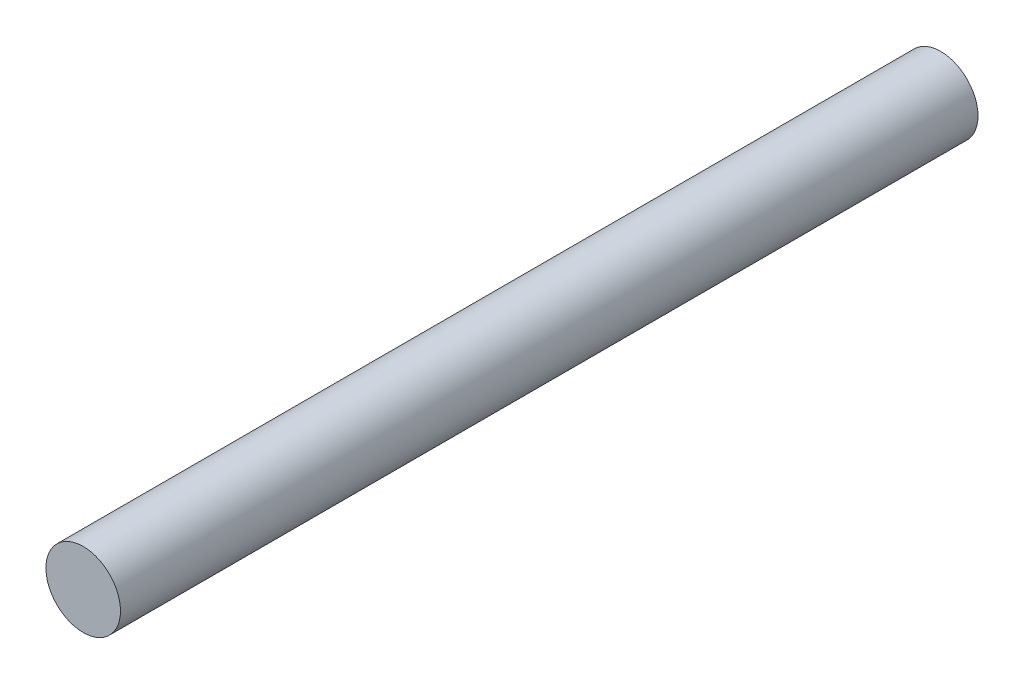
ISO-10303-21;
HEADER;
FILE_DESCRIPTION(('STEP AP214'),'2;1');
FILE_NAME('part.step','',(''),(''),'','','');
FILE_SCHEMA(('AUTOMOTIVE_DESIGN { 1 0 10303 214 1 1 1 1 }'));
ENDSEC;
DATA;
#1=APPLICATION_CONTEXT('core data for automotive mechanical design processes');
#2=APPLICATION_PROTOCOL_DEFINITION('international standard','automotive_design',2000,#1);
#3=PRODUCT_CONTEXT('',#1,'mechanical');
#4=PRODUCT('Part','Part','',(#3));
#5=PRODUCT_RELATED_PRODUCT_CATEGORY('part','',(#4));
#6=PRODUCT_DEFINITION_FORMATION('','',#4);
#7=PRODUCT_DEFINITION_CONTEXT('part definition',#1,'design');
#8=PRODUCT_DEFINITION('design','',#6,#7);
#9=PRODUCT_DEFINITION_SHAPE('','',#8);
#10=(LENGTH_UNIT() NAMED_UNIT(*) SI_UNIT(.MILLI.,.METRE.));
#11=(NAMED_UNIT(*) PLANE_ANGLE_UNIT() SI_UNIT($,.RADIAN.));
#12=(NAMED_UNIT(*) SI_UNIT($,.STERADIAN.) SOLID_ANGLE_UNIT());
#13=UNCERTAINTY_MEASURE_WITH_UNIT(LENGTH_MEASURE(1.E-05),#10,'distance_accuracy_value','');
#14=(GEOMETRIC_REPRESENTATION_CONTEXT(3) GLOBAL_UNCERTAINTY_ASSIGNED_CONTEXT((#13)) GLOBAL_UNIT_ASSIGNED_CONTEXT((#10,
#11,#12)) REPRESENTATION_CONTEXT('',''));
#15=CARTESIAN_POINT('',(0.,0.,0.));
#16=DIRECTION('',(0.,0.,1.));
#17=DIRECTION('',(1.,0.,0.));
#18=AXIS2_PLACEMENT_3D('',#15,#16,#17);
#19=CARTESIAN_POINT('',(0.,0.,115.));
#20=DIRECTION('',(0.,0.,-1.));
#21=DIRECTION('',(-1.,0.,0.));
#22=AXIS2_PLACEMENT_3D('',#19,#20,#21);
#23=CYLINDRICAL_SURFACE('',#22,5.);
#24=CARTESIAN_POINT('',(0.,0.,115.));
#25=DIRECTION('',(0.,0.,1.));
#26=DIRECTION('',(1.,0.,0.));
#27=AXIS2_PLACEMENT_3D('',#24,#25,#26);
#28=CIRCLE('',#27,5.);
#29=CARTESIAN_POINT('',(5.,0.,115.));
#30=VERTEX_POINT('',#29);
#31=EDGE_CURVE('E10',#30,#30,#28,.T.);
#32=ORIENTED_EDGE('',*,*,#31,.F.);
#33=EDGE_LOOP('',(#32));
#34=FACE_BOUND('',#33,.T.);
#35=CARTESIAN_POINT('',(0.,0.,0.));
#36=DIRECTION('',(0.,0.,1.));
#37=DIRECTION('',(1.,0.,0.));
#38=AXIS2_PLACEMENT_3D('',#35,#36,#37);
#39=CIRCLE('',#38,5.);
#40=CARTESIAN_POINT('',(5.,0.,0.));
#41=VERTEX_POINT('',#40);
#42=EDGE_CURVE('E40',#41,#41,#39,.T.);
#43=ORIENTED_EDGE('',*,*,#42,.T.);
#44=EDGE_LOOP('',(#43));
#45=FACE_BOUND('',#44,.T.);
#46=ADVANCED_FACE('F37',(#34,#45),#23,.T.);
#47=CARTESIAN_POINT('',(0.,0.,115.));
#48=DIRECTION('',(0.,0.,1.));
#49=DIRECTION('',(1.,0.,0.));
#50=AXIS2_PLACEMENT_3D('',#47,#48,#49);
#51=PLANE('',#50);
#52=ORIENTED_EDGE('',*,*,#31,.T.);
#53=EDGE_LOOP('',(#52));
#54=FACE_BOUND('',#53,.T.);
#55=ADVANCED_FACE('F54',(#54),#51,.T.);
#56=CARTESIAN_POINT('',(0.,0.,0.));
#57=DIRECTION('',(0.,0.,1.));
#58=DIRECTION('',(1.,0.,0.));
#59=AXIS2_PLACEMENT_3D('',#56,#57,#58);
#60=PLANE('',#59);
#61=ORIENTED_EDGE('',*,*,#42,.F.);
#62=EDGE_LOOP('',(#61));
#63=FACE_BOUND('',#62,.T.);
#64=ADVANCED_FACE('F52',(#63),#60,.F.);
#65=CLOSED_SHELL('',(#46,#55,#64));
#66=MANIFOLD_SOLID_BREP('B2',#65);
#67=ADVANCED_BREP_SHAPE_REPRESENTATION('',(#18,#66),#14);
#68=SHAPE_DEFINITION_REPRESENTATION(#9,#67);
ENDSEC;
END-ISO-10303-21;
